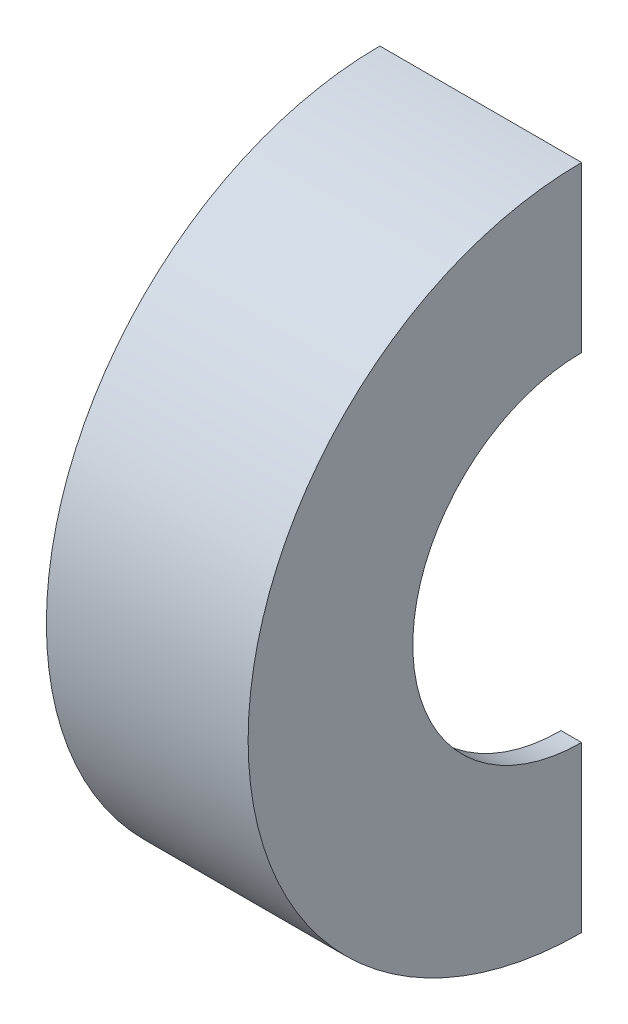
ISO-10303-21;
HEADER;
FILE_DESCRIPTION(('STEP AP214'),'2;1');
FILE_NAME('part.step','',(''),(''),'','','');
FILE_SCHEMA(('AUTOMOTIVE_DESIGN { 1 0 10303 214 1 1 1 1 }'));
ENDSEC;
DATA;
#1=APPLICATION_CONTEXT('core data for automotive mechanical design processes');
#2=APPLICATION_PROTOCOL_DEFINITION('international standard','automotive_design',2000,#1);
#3=PRODUCT_CONTEXT('',#1,'mechanical');
#4=PRODUCT('Part','Part','',(#3));
#5=PRODUCT_RELATED_PRODUCT_CATEGORY('part','',(#4));
#6=PRODUCT_DEFINITION_FORMATION('','',#4);
#7=PRODUCT_DEFINITION_CONTEXT('part definition',#1,'design');
#8=PRODUCT_DEFINITION('design','',#6,#7);
#9=PRODUCT_DEFINITION_SHAPE('','',#8);
#10=(LENGTH_UNIT() NAMED_UNIT(*) SI_UNIT(.MILLI.,.METRE.));
#11=(NAMED_UNIT(*) PLANE_ANGLE_UNIT() SI_UNIT($,.RADIAN.));
#12=(NAMED_UNIT(*) SI_UNIT($,.STERADIAN.) SOLID_ANGLE_UNIT());
#13=UNCERTAINTY_MEASURE_WITH_UNIT(LENGTH_MEASURE(1.E-05),#10,'distance_accuracy_value','');
#14=(GEOMETRIC_REPRESENTATION_CONTEXT(3) GLOBAL_UNCERTAINTY_ASSIGNED_CONTEXT((#13)) GLOBAL_UNIT_ASSIGNED_CONTEXT((#10,
#11,#12)) REPRESENTATION_CONTEXT('',''));
#15=CARTESIAN_POINT('',(0.,0.,0.));
#16=DIRECTION('',(0.,0.,1.));
#17=DIRECTION('',(1.,0.,0.));
#18=AXIS2_PLACEMENT_3D('',#15,#16,#17);
#19=CARTESIAN_POINT('',(98.,-82.,-5.72602939570274E-13));
#20=DIRECTION('',(-1.,0.,0.));
#21=DIRECTION('',(0.,0.,1.));
#22=AXIS2_PLACEMENT_3D('',#19,#20,#21);
#23=PLANE('',#22);
#24=CARTESIAN_POINT('',(98.,0.,0.));
#25=DIRECTION('',(-1.,0.,0.));
#26=DIRECTION('',(0.,0.,1.));
#27=AXIS2_PLACEMENT_3D('',#24,#25,#26);
#28=CIRCLE('',#27,82.);
#29=CARTESIAN_POINT('',(98.,-82.,-5.72602939570274E-13));
#30=VERTEX_POINT('',#29);
#31=CARTESIAN_POINT('',(98.,82.,0.));
#32=VERTEX_POINT('',#31);
#33=EDGE_CURVE('E11',#30,#32,#28,.T.);
#34=ORIENTED_EDGE('',*,*,#33,.T.);
#35=DIRECTION('',(0.,1.,0.));
#36=VECTOR('',#35,1.);
#37=CARTESIAN_POINT('',(98.,82.,0.));
#38=LINE('',#37,#36);
#39=CARTESIAN_POINT('',(98.,162.,0.));
#40=VERTEX_POINT('',#39);
#41=EDGE_CURVE('E115',#32,#40,#38,.T.);
#42=ORIENTED_EDGE('',*,*,#41,.T.);
#43=CARTESIAN_POINT('',(98.,0.,0.));
#44=DIRECTION('',(-1.,0.,0.));
#45=DIRECTION('',(0.,0.,1.));
#46=AXIS2_PLACEMENT_3D('',#43,#44,#45);
#47=CIRCLE('',#46,162.);
#48=CARTESIAN_POINT('',(98.,-162.,-1.13123995378518E-12));
#49=VERTEX_POINT('',#48);
#50=EDGE_CURVE('E97',#49,#40,#47,.T.);
#51=ORIENTED_EDGE('',*,*,#50,.F.);
#52=DIRECTION('',(0.,-1.,0.));
#53=VECTOR('',#52,1.);
#54=CARTESIAN_POINT('',(98.,-82.,-5.72602939570274E-13));
#55=LINE('',#54,#53);
#56=EDGE_CURVE('E136',#30,#49,#55,.T.);
#57=ORIENTED_EDGE('',*,*,#56,.F.);
#58=EDGE_LOOP('',(#34,#42,#51,#57));
#59=FACE_BOUND('',#58,.T.);
#60=ADVANCED_FACE('F33',(#59),#23,.F.);
#61=CARTESIAN_POINT('',(0.,0.,0.));
#62=DIRECTION('',(-1.,0.,0.));
#63=DIRECTION('',(0.,0.,1.));
#64=AXIS2_PLACEMENT_3D('',#61,#62,#63);
#65=CYLINDRICAL_SURFACE('',#64,82.);
#66=CARTESIAN_POINT('',(88.,0.,0.));
#67=DIRECTION('',(-1.,0.,0.));
#68=DIRECTION('',(0.,0.,1.));
#69=AXIS2_PLACEMENT_3D('',#66,#67,#68);
#70=CIRCLE('',#69,82.);
#71=CARTESIAN_POINT('',(88.,-82.,-5.72602939570274E-13));
#72=VERTEX_POINT('',#71);
#73=CARTESIAN_POINT('',(88.,82.,0.));
#74=VERTEX_POINT('',#73);
#75=EDGE_CURVE('E41',#72,#74,#70,.T.);
#76=ORIENTED_EDGE('',*,*,#75,.T.);
#77=DIRECTION('',(1.,0.,0.));
#78=VECTOR('',#77,1.);
#79=CARTESIAN_POINT('',(88.,82.,0.));
#80=LINE('',#79,#78);
#81=EDGE_CURVE('E134',#74,#32,#80,.T.);
#82=ORIENTED_EDGE('',*,*,#81,.T.);
#83=ORIENTED_EDGE('',*,*,#33,.F.);
#84=DIRECTION('',(1.,0.,0.));
#85=VECTOR('',#84,1.);
#86=CARTESIAN_POINT('',(88.,-82.,-5.72602939570274E-13));
#87=LINE('',#86,#85);
#88=EDGE_CURVE('E109',#72,#30,#87,.T.);
#89=ORIENTED_EDGE('',*,*,#88,.F.);
#90=EDGE_LOOP('',(#76,#82,#83,#89));
#91=FACE_BOUND('',#90,.T.);
#92=ADVANCED_FACE('F35',(#91),#65,.F.);
#93=CARTESIAN_POINT('',(88.,-152.,-1.06141032700831E-12));
#94=DIRECTION('',(1.,0.,0.));
#95=DIRECTION('',(0.,0.,-1.));
#96=AXIS2_PLACEMENT_3D('',#93,#94,#95);
#97=PLANE('',#96);
#98=CARTESIAN_POINT('',(88.,0.,0.));
#99=DIRECTION('',(-1.,0.,0.));
#100=DIRECTION('',(0.,0.,1.));
#101=AXIS2_PLACEMENT_3D('',#98,#99,#100);
#102=CIRCLE('',#101,152.);
#103=CARTESIAN_POINT('',(88.,-152.,-1.06141032700831E-12));
#104=VERTEX_POINT('',#103);
#105=CARTESIAN_POINT('',(88.,152.,0.));
#106=VERTEX_POINT('',#105);
#107=EDGE_CURVE('E161',#104,#106,#102,.T.);
#108=ORIENTED_EDGE('',*,*,#107,.T.);
#109=DIRECTION('',(0.,-1.,0.));
#110=VECTOR('',#109,1.);
#111=CARTESIAN_POINT('',(88.,152.,0.));
#112=LINE('',#111,#110);
#113=EDGE_CURVE('E132',#106,#74,#112,.T.);
#114=ORIENTED_EDGE('',*,*,#113,.T.);
#115=ORIENTED_EDGE('',*,*,#75,.F.);
#116=DIRECTION('',(0.,1.,0.));
#117=VECTOR('',#116,1.);
#118=CARTESIAN_POINT('',(88.,-152.,-1.06141032700831E-12));
#119=LINE('',#118,#117);
#120=EDGE_CURVE('E151',#104,#72,#119,.T.);
#121=ORIENTED_EDGE('',*,*,#120,.F.);
#122=EDGE_LOOP('',(#108,#114,#115,#121));
#123=FACE_BOUND('',#122,.T.);
#124=ADVANCED_FACE('F163',(#123),#97,.F.);
#125=CARTESIAN_POINT('',(0.,0.,0.));
#126=DIRECTION('',(-1.,0.,0.));
#127=DIRECTION('',(0.,0.,1.));
#128=AXIS2_PLACEMENT_3D('',#125,#126,#127);
#129=CYLINDRICAL_SURFACE('',#128,152.);
#130=CARTESIAN_POINT('',(10.,0.,0.));
#131=DIRECTION('',(-1.,0.,0.));
#132=DIRECTION('',(0.,0.,1.));
#133=AXIS2_PLACEMENT_3D('',#130,#131,#132);
#134=CIRCLE('',#133,152.);
#135=CARTESIAN_POINT('',(10.,-152.,-1.06141032700831E-12));
#136=VERTEX_POINT('',#135);
#137=CARTESIAN_POINT('',(10.,152.,0.));
#138=VERTEX_POINT('',#137);
#139=EDGE_CURVE('E159',#136,#138,#134,.T.);
#140=ORIENTED_EDGE('',*,*,#139,.T.);
#141=DIRECTION('',(1.,0.,0.));
#142=VECTOR('',#141,1.);
#143=CARTESIAN_POINT('',(10.,152.,0.));
#144=LINE('',#143,#142);
#145=EDGE_CURVE('E129',#138,#106,#144,.T.);
#146=ORIENTED_EDGE('',*,*,#145,.T.);
#147=ORIENTED_EDGE('',*,*,#107,.F.);
#148=DIRECTION('',(1.,0.,0.));
#149=VECTOR('',#148,1.);
#150=CARTESIAN_POINT('',(10.,-152.,-1.06141032700831E-12));
#151=LINE('',#150,#149);
#152=EDGE_CURVE('E148',#136,#104,#151,.T.);
#153=ORIENTED_EDGE('',*,*,#152,.F.);
#154=EDGE_LOOP('',(#140,#146,#147,#153));
#155=FACE_BOUND('',#154,.T.);
#156=ADVANCED_FACE('F167',(#155),#129,.F.);
#157=CARTESIAN_POINT('',(10.,-82.,-5.72602939570274E-13));
#158=DIRECTION('',(-1.,0.,0.));
#159=DIRECTION('',(0.,0.,1.));
#160=AXIS2_PLACEMENT_3D('',#157,#158,#159);
#161=PLANE('',#160);
#162=CARTESIAN_POINT('',(10.,0.,0.));
#163=DIRECTION('',(-1.,0.,0.));
#164=DIRECTION('',(0.,0.,1.));
#165=AXIS2_PLACEMENT_3D('',#162,#163,#164);
#166=CIRCLE('',#165,82.);
#167=CARTESIAN_POINT('',(10.,-82.,-5.72602939570274E-13));
#168=VERTEX_POINT('',#167);
#169=CARTESIAN_POINT('',(10.,82.,0.));
#170=VERTEX_POINT('',#169);
#171=EDGE_CURVE('E157',#168,#170,#166,.T.);
#172=ORIENTED_EDGE('',*,*,#171,.T.);
#173=DIRECTION('',(0.,1.,0.));
#174=VECTOR('',#173,1.);
#175=CARTESIAN_POINT('',(10.,82.,0.));
#176=LINE('',#175,#174);
#177=EDGE_CURVE('E126',#170,#138,#176,.T.);
#178=ORIENTED_EDGE('',*,*,#177,.T.);
#179=ORIENTED_EDGE('',*,*,#139,.F.);
#180=DIRECTION('',(0.,-1.,0.));
#181=VECTOR('',#180,1.);
#182=CARTESIAN_POINT('',(10.,-82.,-5.72602939570274E-13));
#183=LINE('',#182,#181);
#184=EDGE_CURVE('E145',#168,#136,#183,.T.);
#185=ORIENTED_EDGE('',*,*,#184,.F.);
#186=EDGE_LOOP('',(#172,#178,#179,#185));
#187=FACE_BOUND('',#186,.T.);
#188=ADVANCED_FACE('F171',(#187),#161,.F.);
#189=CARTESIAN_POINT('',(0.,0.,0.));
#190=DIRECTION('',(-1.,0.,0.));
#191=DIRECTION('',(0.,0.,1.));
#192=AXIS2_PLACEMENT_3D('',#189,#190,#191);
#193=CYLINDRICAL_SURFACE('',#192,82.);
#194=CARTESIAN_POINT('',(0.,0.,0.));
#195=DIRECTION('',(-1.,0.,0.));
#196=DIRECTION('',(0.,0.,1.));
#197=AXIS2_PLACEMENT_3D('',#194,#195,#196);
#198=CIRCLE('',#197,82.);
#199=CARTESIAN_POINT('',(0.,-82.,-5.72602939570274E-13));
#200=VERTEX_POINT('',#199);
#201=CARTESIAN_POINT('',(0.,82.,0.));
#202=VERTEX_POINT('',#201);
#203=EDGE_CURVE('E155',#200,#202,#198,.T.);
#204=ORIENTED_EDGE('',*,*,#203,.T.);
#205=DIRECTION('',(1.,0.,0.));
#206=VECTOR('',#205,1.);
#207=CARTESIAN_POINT('',(0.,82.,0.));
#208=LINE('',#207,#206);
#209=EDGE_CURVE('E123',#202,#170,#208,.T.);
#210=ORIENTED_EDGE('',*,*,#209,.T.);
#211=ORIENTED_EDGE('',*,*,#171,.F.);
#212=DIRECTION('',(1.,0.,0.));
#213=VECTOR('',#212,1.);
#214=CARTESIAN_POINT('',(0.,-82.,-5.72602939570274E-13));
#215=LINE('',#214,#213);
#216=EDGE_CURVE('E142',#200,#168,#215,.T.);
#217=ORIENTED_EDGE('',*,*,#216,.F.);
#218=EDGE_LOOP('',(#204,#210,#211,#217));
#219=FACE_BOUND('',#218,.T.);
#220=ADVANCED_FACE('F174',(#219),#193,.F.);
#221=CARTESIAN_POINT('',(0.,-82.,-5.72602939570274E-13));
#222=DIRECTION('',(1.,0.,0.));
#223=DIRECTION('',(0.,0.,-1.));
#224=AXIS2_PLACEMENT_3D('',#221,#222,#223);
#225=PLANE('',#224);
#226=CARTESIAN_POINT('',(0.,0.,0.));
#227=DIRECTION('',(-1.,0.,0.));
#228=DIRECTION('',(0.,0.,1.));
#229=AXIS2_PLACEMENT_3D('',#226,#227,#228);
#230=CIRCLE('',#229,162.);
#231=CARTESIAN_POINT('',(0.,-162.,-1.13123995378518E-12));
#232=VERTEX_POINT('',#231);
#233=CARTESIAN_POINT('',(0.,162.,0.));
#234=VERTEX_POINT('',#233);
#235=EDGE_CURVE('E108',#232,#234,#230,.T.);
#236=ORIENTED_EDGE('',*,*,#235,.T.);
#237=DIRECTION('',(0.,-1.,0.));
#238=VECTOR('',#237,1.);
#239=CARTESIAN_POINT('',(0.,82.,0.));
#240=LINE('',#239,#238);
#241=EDGE_CURVE('E118',#234,#202,#240,.T.);
#242=ORIENTED_EDGE('',*,*,#241,.T.);
#243=ORIENTED_EDGE('',*,*,#203,.F.);
#244=DIRECTION('',(0.,1.,0.));
#245=VECTOR('',#244,1.);
#246=CARTESIAN_POINT('',(0.,-82.,-5.72602939570274E-13));
#247=LINE('',#246,#245);
#248=EDGE_CURVE('E139',#232,#200,#247,.T.);
#249=ORIENTED_EDGE('',*,*,#248,.F.);
#250=EDGE_LOOP('',(#236,#242,#243,#249));
#251=FACE_BOUND('',#250,.T.);
#252=ADVANCED_FACE('F177',(#251),#225,.F.);
#253=CARTESIAN_POINT('',(0.,0.,0.));
#254=DIRECTION('',(-1.,0.,0.));
#255=DIRECTION('',(0.,0.,1.));
#256=AXIS2_PLACEMENT_3D('',#253,#254,#255);
#257=CYLINDRICAL_SURFACE('',#256,162.);
#258=DIRECTION('',(-1.,0.,0.));
#259=VECTOR('',#258,1.);
#260=CARTESIAN_POINT('',(0.,-162.,-1.13123995378518E-12));
#261=LINE('',#260,#259);
#262=EDGE_CURVE('E103',#49,#232,#261,.T.);
#263=ORIENTED_EDGE('',*,*,#262,.F.);
#264=ORIENTED_EDGE('',*,*,#50,.T.);
#265=DIRECTION('',(-1.,0.,0.));
#266=VECTOR('',#265,1.);
#267=CARTESIAN_POINT('',(0.,162.,0.));
#268=LINE('',#267,#266);
#269=EDGE_CURVE('E100',#40,#234,#268,.T.);
#270=ORIENTED_EDGE('',*,*,#269,.T.);
#271=ORIENTED_EDGE('',*,*,#235,.F.);
#272=EDGE_LOOP('',(#263,#264,#270,#271));
#273=FACE_BOUND('',#272,.T.);
#274=ADVANCED_FACE('F99',(#273),#257,.T.);
#275=CARTESIAN_POINT('',(0.,0.,0.));
#276=DIRECTION('',(0.,0.,1.));
#277=DIRECTION('',(-1.,0.,0.));
#278=AXIS2_PLACEMENT_3D('',#275,#276,#277);
#279=PLANE('',#278);
#280=ORIENTED_EDGE('',*,*,#56,.T.);
#281=ORIENTED_EDGE('',*,*,#262,.T.);
#282=ORIENTED_EDGE('',*,*,#248,.T.);
#283=ORIENTED_EDGE('',*,*,#216,.T.);
#284=ORIENTED_EDGE('',*,*,#184,.T.);
#285=ORIENTED_EDGE('',*,*,#152,.T.);
#286=ORIENTED_EDGE('',*,*,#120,.T.);
#287=ORIENTED_EDGE('',*,*,#88,.T.);
#288=EDGE_LOOP('',(#280,#281,#282,#283,#284,#285,#286,#287));
#289=FACE_BOUND('',#288,.T.);
#290=ADVANCED_FACE('F179',(#289),#279,.F.);
#291=CARTESIAN_POINT('',(0.,0.,0.));
#292=DIRECTION('',(0.,0.,-1.));
#293=DIRECTION('',(-1.,0.,0.));
#294=AXIS2_PLACEMENT_3D('',#291,#292,#293);
#295=PLANE('',#294);
#296=ORIENTED_EDGE('',*,*,#41,.F.);
#297=ORIENTED_EDGE('',*,*,#81,.F.);
#298=ORIENTED_EDGE('',*,*,#113,.F.);
#299=ORIENTED_EDGE('',*,*,#145,.F.);
#300=ORIENTED_EDGE('',*,*,#177,.F.);
#301=ORIENTED_EDGE('',*,*,#209,.F.);
#302=ORIENTED_EDGE('',*,*,#241,.F.);
#303=ORIENTED_EDGE('',*,*,#269,.F.);
#304=EDGE_LOOP('',(#296,#297,#298,#299,#300,#301,#302,#303));
#305=FACE_BOUND('',#304,.T.);
#306=ADVANCED_FACE('F113',(#305),#295,.T.);
#307=CLOSED_SHELL('',(#60,#92,#124,#156,#188,#220,#252,#274,#290,#306));
#308=MANIFOLD_SOLID_BREP('B2',#307);
#309=ADVANCED_BREP_SHAPE_REPRESENTATION('',(#18,#308),#14);
#310=SHAPE_DEFINITION_REPRESENTATION(#9,#309);
ENDSEC;
END-ISO-10303-21;
